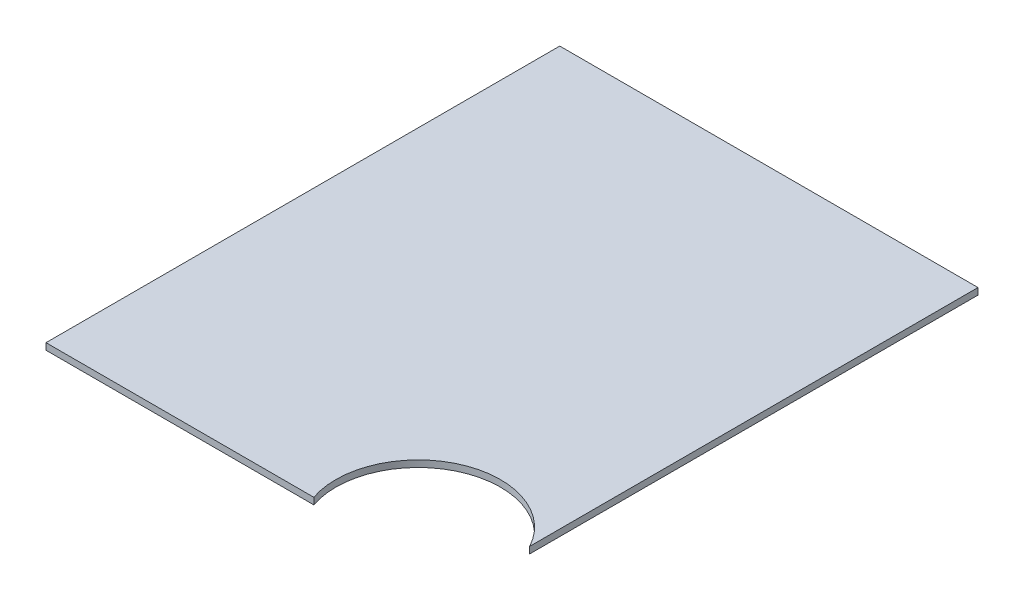
ISO-10303-21;
HEADER;
FILE_DESCRIPTION(('STEP AP214'),'2;1');
FILE_NAME('part.step','',(''),(''),'','','');
FILE_SCHEMA(('AUTOMOTIVE_DESIGN { 1 0 10303 214 1 1 1 1 }'));
ENDSEC;
DATA;
#1=APPLICATION_CONTEXT('core data for automotive mechanical design processes');
#2=APPLICATION_PROTOCOL_DEFINITION('international standard','automotive_design',2000,#1);
#3=PRODUCT_CONTEXT('',#1,'mechanical');
#4=PRODUCT('Part','Part','',(#3));
#5=PRODUCT_RELATED_PRODUCT_CATEGORY('part','',(#4));
#6=PRODUCT_DEFINITION_FORMATION('','',#4);
#7=PRODUCT_DEFINITION_CONTEXT('part definition',#1,'design');
#8=PRODUCT_DEFINITION('design','',#6,#7);
#9=PRODUCT_DEFINITION_SHAPE('','',#8);
#10=(LENGTH_UNIT() NAMED_UNIT(*) SI_UNIT(.MILLI.,.METRE.));
#11=(NAMED_UNIT(*) PLANE_ANGLE_UNIT() SI_UNIT($,.RADIAN.));
#12=(NAMED_UNIT(*) SI_UNIT($,.STERADIAN.) SOLID_ANGLE_UNIT());
#13=UNCERTAINTY_MEASURE_WITH_UNIT(LENGTH_MEASURE(1.E-05),#10,'distance_accuracy_value','');
#14=(GEOMETRIC_REPRESENTATION_CONTEXT(3) GLOBAL_UNCERTAINTY_ASSIGNED_CONTEXT((#13)) GLOBAL_UNIT_ASSIGNED_CONTEXT((#10,
#11,#12)) REPRESENTATION_CONTEXT('',''));
#15=CARTESIAN_POINT('',(0.,0.,0.));
#16=DIRECTION('',(0.,0.,1.));
#17=DIRECTION('',(1.,0.,0.));
#18=AXIS2_PLACEMENT_3D('',#15,#16,#17);
#19=CARTESIAN_POINT('',(-63.4999999999999,2.,78.));
#20=DIRECTION('',(1.,0.,0.));
#21=DIRECTION('',(0.,0.,-1.));
#22=AXIS2_PLACEMENT_3D('',#19,#20,#21);
#23=PLANE('',#22);
#24=DIRECTION('',(0.,0.,1.));
#25=VECTOR('',#24,1.);
#26=CARTESIAN_POINT('',(-63.4999999999999,0.,78.));
#27=LINE('',#26,#25);
#28=CARTESIAN_POINT('',(-63.4999999999999,0.,-78.));
#29=VERTEX_POINT('',#28);
#30=CARTESIAN_POINT('',(-63.4999999999999,0.,78.));
#31=VERTEX_POINT('',#30);
#32=EDGE_CURVE('E107',#29,#31,#27,.T.);
#33=ORIENTED_EDGE('',*,*,#32,.T.);
#34=DIRECTION('',(0.,-1.,0.));
#35=VECTOR('',#34,1.);
#36=CARTESIAN_POINT('',(-63.4999999999999,2.,78.));
#37=LINE('',#36,#35);
#38=CARTESIAN_POINT('',(-63.4999999999999,2.,78.));
#39=VERTEX_POINT('',#38);
#40=EDGE_CURVE('E41',#39,#31,#37,.T.);
#41=ORIENTED_EDGE('',*,*,#40,.F.);
#42=DIRECTION('',(0.,0.,1.));
#43=VECTOR('',#42,1.);
#44=CARTESIAN_POINT('',(-63.4999999999999,2.,78.));
#45=LINE('',#44,#43);
#46=CARTESIAN_POINT('',(-63.4999999999999,2.,-78.));
#47=VERTEX_POINT('',#46);
#48=EDGE_CURVE('E105',#47,#39,#45,.T.);
#49=ORIENTED_EDGE('',*,*,#48,.F.);
#50=DIRECTION('',(0.,-1.,0.));
#51=VECTOR('',#50,1.);
#52=CARTESIAN_POINT('',(-63.4999999999999,2.,-78.));
#53=LINE('',#52,#51);
#54=EDGE_CURVE('E111',#47,#29,#53,.T.);
#55=ORIENTED_EDGE('',*,*,#54,.T.);
#56=EDGE_LOOP('',(#33,#41,#49,#55));
#57=FACE_BOUND('',#56,.T.);
#58=ADVANCED_FACE('F34',(#57),#23,.F.);
#59=CARTESIAN_POINT('',(63.5000000000001,2.,77.9999999999999));
#60=DIRECTION('',(0.,0.,-1.));
#61=DIRECTION('',(-1.,0.,0.));
#62=AXIS2_PLACEMENT_3D('',#59,#60,#61);
#63=PLANE('',#62);
#64=DIRECTION('',(1.,0.,0.));
#65=VECTOR('',#64,1.);
#66=CARTESIAN_POINT('',(63.5000000000001,0.,77.9999999999999));
#67=LINE('',#66,#65);
#68=CARTESIAN_POINT('',(17.8145614353459,0.,77.9999999999999));
#69=VERTEX_POINT('',#68);
#70=EDGE_CURVE('E103',#31,#69,#67,.T.);
#71=ORIENTED_EDGE('',*,*,#70,.T.);
#72=DIRECTION('',(0.,1.,0.));
#73=VECTOR('',#72,1.);
#74=CARTESIAN_POINT('',(17.8145614353459,0.,77.9999999999999));
#75=LINE('',#74,#73);
#76=CARTESIAN_POINT('',(17.8145614353459,2.,77.9999999999999));
#77=VERTEX_POINT('',#76);
#78=EDGE_CURVE('E48',#69,#77,#75,.T.);
#79=ORIENTED_EDGE('',*,*,#78,.T.);
#80=DIRECTION('',(1.,0.,0.));
#81=VECTOR('',#80,1.);
#82=CARTESIAN_POINT('',(63.5000000000001,2.,77.9999999999999));
#83=LINE('',#82,#81);
#84=EDGE_CURVE('E79',#39,#77,#83,.T.);
#85=ORIENTED_EDGE('',*,*,#84,.F.);
#86=ORIENTED_EDGE('',*,*,#40,.T.);
#87=EDGE_LOOP('',(#71,#79,#85,#86));
#88=FACE_BOUND('',#87,.T.);
#89=ADVANCED_FACE('F116',(#88),#63,.F.);
#90=CARTESIAN_POINT('',(63.5000000000001,2.,77.9999999999999));
#91=DIRECTION('',(-1.,0.,0.));
#92=DIRECTION('',(0.,0.,1.));
#93=AXIS2_PLACEMENT_3D('',#90,#91,#92);
#94=PLANE('',#93);
#95=DIRECTION('',(0.,0.,-1.));
#96=VECTOR('',#95,1.);
#97=CARTESIAN_POINT('',(63.5000000000001,2.,77.9999999999999));
#98=LINE('',#97,#96);
#99=CARTESIAN_POINT('',(63.5000000000001,2.,58.1256579129622));
#100=VERTEX_POINT('',#99);
#101=CARTESIAN_POINT('',(63.5000000000001,2.,-78.0000000000001));
#102=VERTEX_POINT('',#101);
#103=EDGE_CURVE('E98',#100,#102,#98,.T.);
#104=ORIENTED_EDGE('',*,*,#103,.F.);
#105=DIRECTION('',(0.,1.,0.));
#106=VECTOR('',#105,1.);
#107=CARTESIAN_POINT('',(63.5000000000001,0.,58.1256579129622));
#108=LINE('',#107,#106);
#109=CARTESIAN_POINT('',(63.5000000000001,0.,58.1256579129622));
#110=VERTEX_POINT('',#109);
#111=EDGE_CURVE('E88',#100,#110,#108,.F.);
#112=ORIENTED_EDGE('',*,*,#111,.T.);
#113=DIRECTION('',(0.,0.,-1.));
#114=VECTOR('',#113,1.);
#115=CARTESIAN_POINT('',(63.5000000000001,0.,77.9999999999999));
#116=LINE('',#115,#114);
#117=CARTESIAN_POINT('',(63.5000000000001,0.,-78.0000000000001));
#118=VERTEX_POINT('',#117);
#119=EDGE_CURVE('E97',#110,#118,#116,.T.);
#120=ORIENTED_EDGE('',*,*,#119,.T.);
#121=DIRECTION('',(0.,-1.,0.));
#122=VECTOR('',#121,1.);
#123=CARTESIAN_POINT('',(63.5000000000001,2.,-78.0000000000001));
#124=LINE('',#123,#122);
#125=EDGE_CURVE('E113',#102,#118,#124,.T.);
#126=ORIENTED_EDGE('',*,*,#125,.F.);
#127=EDGE_LOOP('',(#104,#112,#120,#126));
#128=FACE_BOUND('',#127,.T.);
#129=ADVANCED_FACE('F95',(#128),#94,.F.);
#130=CARTESIAN_POINT('',(63.5000000000001,2.,-78.0000000000001));
#131=DIRECTION('',(0.,0.,1.));
#132=DIRECTION('',(1.,0.,0.));
#133=AXIS2_PLACEMENT_3D('',#130,#131,#132);
#134=PLANE('',#133);
#135=DIRECTION('',(-1.,0.,0.));
#136=VECTOR('',#135,1.);
#137=CARTESIAN_POINT('',(63.5000000000001,0.,-78.0000000000001));
#138=LINE('',#137,#136);
#139=EDGE_CURVE('E73',#118,#29,#138,.T.);
#140=ORIENTED_EDGE('',*,*,#139,.T.);
#141=ORIENTED_EDGE('',*,*,#54,.F.);
#142=DIRECTION('',(-1.,0.,0.));
#143=VECTOR('',#142,1.);
#144=CARTESIAN_POINT('',(63.5000000000001,2.,-78.0000000000001));
#145=LINE('',#144,#143);
#146=EDGE_CURVE('E56',#102,#47,#145,.T.);
#147=ORIENTED_EDGE('',*,*,#146,.F.);
#148=ORIENTED_EDGE('',*,*,#125,.T.);
#149=EDGE_LOOP('',(#140,#141,#147,#148));
#150=FACE_BOUND('',#149,.T.);
#151=ADVANCED_FACE('F127',(#150),#134,.F.);
#152=CARTESIAN_POINT('',(0.,2.,0.));
#153=DIRECTION('',(0.,1.,0.));
#154=DIRECTION('',(0.,0.,1.));
#155=AXIS2_PLACEMENT_3D('',#152,#153,#154);
#156=PLANE('',#155);
#157=CARTESIAN_POINT('',(41.4999999999999,2.,70.));
#158=DIRECTION('',(0.,1.,0.));
#159=DIRECTION('',(0.,0.,-1.));
#160=AXIS2_PLACEMENT_3D('',#157,#158,#159);
#161=CIRCLE('',#160,25.);
#162=EDGE_CURVE('E99',#100,#77,#161,.T.);
#163=ORIENTED_EDGE('',*,*,#162,.F.);
#164=ORIENTED_EDGE('',*,*,#103,.T.);
#165=ORIENTED_EDGE('',*,*,#146,.T.);
#166=ORIENTED_EDGE('',*,*,#48,.T.);
#167=ORIENTED_EDGE('',*,*,#84,.T.);
#168=EDGE_LOOP('',(#163,#164,#165,#166,#167));
#169=FACE_BOUND('',#168,.T.);
#170=ADVANCED_FACE('F125',(#169),#156,.T.);
#171=CARTESIAN_POINT('',(0.,0.,0.));
#172=DIRECTION('',(0.,1.,0.));
#173=DIRECTION('',(0.,0.,1.));
#174=AXIS2_PLACEMENT_3D('',#171,#172,#173);
#175=PLANE('',#174);
#176=ORIENTED_EDGE('',*,*,#119,.F.);
#177=CARTESIAN_POINT('',(41.4999999999999,0.,70.));
#178=DIRECTION('',(0.,1.,0.));
#179=DIRECTION('',(0.,0.,1.));
#180=AXIS2_PLACEMENT_3D('',#177,#178,#179);
#181=CIRCLE('',#180,25.);
#182=EDGE_CURVE('E11',#110,#69,#181,.T.);
#183=ORIENTED_EDGE('',*,*,#182,.T.);
#184=ORIENTED_EDGE('',*,*,#70,.F.);
#185=ORIENTED_EDGE('',*,*,#32,.F.);
#186=ORIENTED_EDGE('',*,*,#139,.F.);
#187=EDGE_LOOP('',(#176,#183,#184,#185,#186));
#188=FACE_BOUND('',#187,.T.);
#189=ADVANCED_FACE('F101',(#188),#175,.F.);
#190=CARTESIAN_POINT('',(41.4999999999999,0.,70.));
#191=DIRECTION('',(0.,1.,0.));
#192=DIRECTION('',(0.,0.,1.));
#193=AXIS2_PLACEMENT_3D('',#190,#191,#192);
#194=CYLINDRICAL_SURFACE('',#193,25.);
#195=ORIENTED_EDGE('',*,*,#182,.F.);
#196=ORIENTED_EDGE('',*,*,#111,.F.);
#197=ORIENTED_EDGE('',*,*,#162,.T.);
#198=ORIENTED_EDGE('',*,*,#78,.F.);
#199=EDGE_LOOP('',(#195,#196,#197,#198));
#200=FACE_BOUND('',#199,.T.);
#201=ADVANCED_FACE('F87',(#200),#194,.F.);
#202=CLOSED_SHELL('',(#58,#89,#129,#151,#170,#189,#201));
#203=MANIFOLD_SOLID_BREP('B2',#202);
#204=ADVANCED_BREP_SHAPE_REPRESENTATION('',(#18,#203),#14);
#205=SHAPE_DEFINITION_REPRESENTATION(#9,#204);
ENDSEC;
END-ISO-10303-21;
